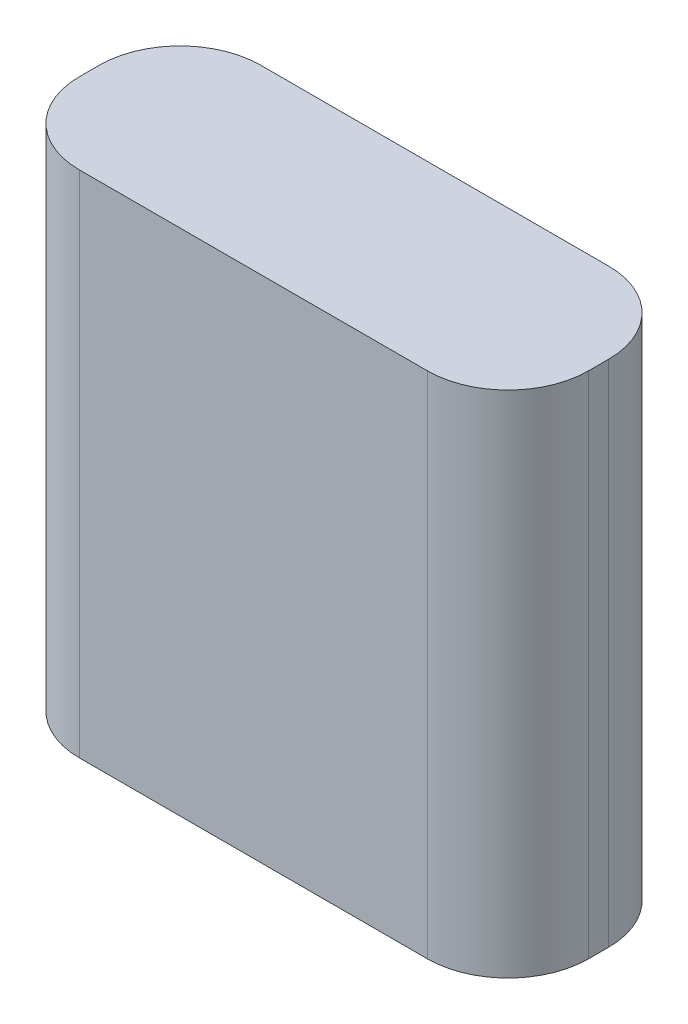
ISO-10303-21;
HEADER;
FILE_DESCRIPTION(('STEP AP214'),'2;1');
FILE_NAME('part.step','',(''),(''),'','','');
FILE_SCHEMA(('AUTOMOTIVE_DESIGN { 1 0 10303 214 1 1 1 1 }'));
ENDSEC;
DATA;
#1=APPLICATION_CONTEXT('core data for automotive mechanical design processes');
#2=APPLICATION_PROTOCOL_DEFINITION('international standard','automotive_design',2000,#1);
#3=PRODUCT_CONTEXT('',#1,'mechanical');
#4=PRODUCT('Part','Part','',(#3));
#5=PRODUCT_RELATED_PRODUCT_CATEGORY('part','',(#4));
#6=PRODUCT_DEFINITION_FORMATION('','',#4);
#7=PRODUCT_DEFINITION_CONTEXT('part definition',#1,'design');
#8=PRODUCT_DEFINITION('design','',#6,#7);
#9=PRODUCT_DEFINITION_SHAPE('','',#8);
#10=(LENGTH_UNIT() NAMED_UNIT(*) SI_UNIT(.MILLI.,.METRE.));
#11=(NAMED_UNIT(*) PLANE_ANGLE_UNIT() SI_UNIT($,.RADIAN.));
#12=(NAMED_UNIT(*) SI_UNIT($,.STERADIAN.) SOLID_ANGLE_UNIT());
#13=UNCERTAINTY_MEASURE_WITH_UNIT(LENGTH_MEASURE(1.E-05),#10,'distance_accuracy_value','');
#14=(GEOMETRIC_REPRESENTATION_CONTEXT(3) GLOBAL_UNCERTAINTY_ASSIGNED_CONTEXT((#13)) GLOBAL_UNIT_ASSIGNED_CONTEXT((#10,
#11,#12)) REPRESENTATION_CONTEXT('',''));
#15=CARTESIAN_POINT('',(0.,0.,0.));
#16=DIRECTION('',(0.,0.,1.));
#17=DIRECTION('',(1.,0.,0.));
#18=AXIS2_PLACEMENT_3D('',#15,#16,#17);
#19=CARTESIAN_POINT('',(40.132,80.264,14.2875));
#20=DIRECTION('',(-1.,0.,0.));
#21=DIRECTION('',(0.,0.,1.));
#22=AXIS2_PLACEMENT_3D('',#19,#20,#21);
#23=PLANE('',#22);
#24=DIRECTION('',(0.,0.,-1.));
#25=VECTOR('',#24,1.);
#26=CARTESIAN_POINT('',(40.132,80.264,14.2875));
#27=LINE('',#26,#25);
#28=CARTESIAN_POINT('',(40.132,80.264,1.5875));
#29=VERTEX_POINT('',#28);
#30=CARTESIAN_POINT('',(40.132,80.264,-1.5875));
#31=VERTEX_POINT('',#30);
#32=EDGE_CURVE('E127',#29,#31,#27,.T.);
#33=ORIENTED_EDGE('',*,*,#32,.F.);
#34=DIRECTION('',(0.,-1.,0.));
#35=VECTOR('',#34,1.);
#36=CARTESIAN_POINT('',(40.132,80.264,1.5875));
#37=LINE('',#36,#35);
#38=CARTESIAN_POINT('',(40.132,0.,1.5875));
#39=VERTEX_POINT('',#38);
#40=EDGE_CURVE('E11',#29,#39,#37,.T.);
#41=ORIENTED_EDGE('',*,*,#40,.T.);
#42=DIRECTION('',(0.,0.,-1.));
#43=VECTOR('',#42,1.);
#44=CARTESIAN_POINT('',(40.132,0.,14.2875));
#45=LINE('',#44,#43);
#46=CARTESIAN_POINT('',(40.132,0.,-1.5875));
#47=VERTEX_POINT('',#46);
#48=EDGE_CURVE('E158',#39,#47,#45,.T.);
#49=ORIENTED_EDGE('',*,*,#48,.T.);
#50=DIRECTION('',(0.,-1.,0.));
#51=VECTOR('',#50,1.);
#52=CARTESIAN_POINT('',(40.132,80.264,-1.5875));
#53=LINE('',#52,#51);
#54=EDGE_CURVE('E41',#47,#31,#53,.F.);
#55=ORIENTED_EDGE('',*,*,#54,.T.);
#56=EDGE_LOOP('',(#33,#41,#49,#55));
#57=FACE_BOUND('',#56,.T.);
#58=ADVANCED_FACE('F33',(#57),#23,.F.);
#59=CARTESIAN_POINT('',(-40.132,80.264,-14.2875));
#60=DIRECTION('',(0.,0.,1.));
#61=DIRECTION('',(1.,0.,0.));
#62=AXIS2_PLACEMENT_3D('',#59,#60,#61);
#63=PLANE('',#62);
#64=DIRECTION('',(-1.,0.,0.));
#65=VECTOR('',#64,1.);
#66=CARTESIAN_POINT('',(-40.132,0.,-14.2875));
#67=LINE('',#66,#65);
#68=CARTESIAN_POINT('',(27.432,0.,-14.2875));
#69=VERTEX_POINT('',#68);
#70=CARTESIAN_POINT('',(-27.432,0.,-14.2875));
#71=VERTEX_POINT('',#70);
#72=EDGE_CURVE('E132',#69,#71,#67,.T.);
#73=ORIENTED_EDGE('',*,*,#72,.T.);
#74=DIRECTION('',(0.,-1.,0.));
#75=VECTOR('',#74,1.);
#76=CARTESIAN_POINT('',(-27.432,80.264,-14.2875));
#77=LINE('',#76,#75);
#78=CARTESIAN_POINT('',(-27.432,80.264,-14.2875));
#79=VERTEX_POINT('',#78);
#80=EDGE_CURVE('E48',#71,#79,#77,.F.);
#81=ORIENTED_EDGE('',*,*,#80,.T.);
#82=DIRECTION('',(-1.,0.,0.));
#83=VECTOR('',#82,1.);
#84=CARTESIAN_POINT('',(-40.132,80.264,-14.2875));
#85=LINE('',#84,#83);
#86=CARTESIAN_POINT('',(27.432,80.264,-14.2875));
#87=VERTEX_POINT('',#86);
#88=EDGE_CURVE('E130',#87,#79,#85,.T.);
#89=ORIENTED_EDGE('',*,*,#88,.F.);
#90=DIRECTION('',(0.,-1.,0.));
#91=VECTOR('',#90,1.);
#92=CARTESIAN_POINT('',(27.432,80.264,-14.2875));
#93=LINE('',#92,#91);
#94=EDGE_CURVE('E150',#87,#69,#93,.T.);
#95=ORIENTED_EDGE('',*,*,#94,.T.);
#96=EDGE_LOOP('',(#73,#81,#89,#95));
#97=FACE_BOUND('',#96,.T.);
#98=ADVANCED_FACE('F165',(#97),#63,.F.);
#99=CARTESIAN_POINT('',(-40.132,80.264,14.2875));
#100=DIRECTION('',(1.,0.,0.));
#101=DIRECTION('',(0.,0.,-1.));
#102=AXIS2_PLACEMENT_3D('',#99,#100,#101);
#103=PLANE('',#102);
#104=DIRECTION('',(0.,0.,1.));
#105=VECTOR('',#104,1.);
#106=CARTESIAN_POINT('',(-40.132,0.,14.2875));
#107=LINE('',#106,#105);
#108=CARTESIAN_POINT('',(-40.132,0.,-1.5875));
#109=VERTEX_POINT('',#108);
#110=CARTESIAN_POINT('',(-40.132,0.,1.5875));
#111=VERTEX_POINT('',#110);
#112=EDGE_CURVE('E128',#109,#111,#107,.T.);
#113=ORIENTED_EDGE('',*,*,#112,.T.);
#114=DIRECTION('',(0.,-1.,0.));
#115=VECTOR('',#114,1.);
#116=CARTESIAN_POINT('',(-40.132,80.264,1.5875));
#117=LINE('',#116,#115);
#118=CARTESIAN_POINT('',(-40.132,80.264,1.5875));
#119=VERTEX_POINT('',#118);
#120=EDGE_CURVE('E105',#111,#119,#117,.F.);
#121=ORIENTED_EDGE('',*,*,#120,.T.);
#122=DIRECTION('',(0.,0.,1.));
#123=VECTOR('',#122,1.);
#124=CARTESIAN_POINT('',(-40.132,80.264,14.2875));
#125=LINE('',#124,#123);
#126=CARTESIAN_POINT('',(-40.132,80.264,-1.5875));
#127=VERTEX_POINT('',#126);
#128=EDGE_CURVE('E169',#127,#119,#125,.T.);
#129=ORIENTED_EDGE('',*,*,#128,.F.);
#130=DIRECTION('',(0.,-1.,0.));
#131=VECTOR('',#130,1.);
#132=CARTESIAN_POINT('',(-40.132,80.264,-1.5875));
#133=LINE('',#132,#131);
#134=EDGE_CURVE('E110',#127,#109,#133,.T.);
#135=ORIENTED_EDGE('',*,*,#134,.T.);
#136=EDGE_LOOP('',(#113,#121,#129,#135));
#137=FACE_BOUND('',#136,.T.);
#138=ADVANCED_FACE('F177',(#137),#103,.F.);
#139=CARTESIAN_POINT('',(-40.132,80.264,14.2875));
#140=DIRECTION('',(0.,0.,-1.));
#141=DIRECTION('',(-1.,0.,0.));
#142=AXIS2_PLACEMENT_3D('',#139,#140,#141);
#143=PLANE('',#142);
#144=DIRECTION('',(1.,0.,0.));
#145=VECTOR('',#144,1.);
#146=CARTESIAN_POINT('',(-40.132,80.264,14.2875));
#147=LINE('',#146,#145);
#148=CARTESIAN_POINT('',(-27.432,80.264,14.2875));
#149=VERTEX_POINT('',#148);
#150=CARTESIAN_POINT('',(27.432,80.264,14.2875));
#151=VERTEX_POINT('',#150);
#152=EDGE_CURVE('E120',#149,#151,#147,.T.);
#153=ORIENTED_EDGE('',*,*,#152,.F.);
#154=DIRECTION('',(0.,-1.,0.));
#155=VECTOR('',#154,1.);
#156=CARTESIAN_POINT('',(-27.432,80.264,14.2875));
#157=LINE('',#156,#155);
#158=CARTESIAN_POINT('',(-27.432,0.,14.2875));
#159=VERTEX_POINT('',#158);
#160=EDGE_CURVE('E104',#149,#159,#157,.T.);
#161=ORIENTED_EDGE('',*,*,#160,.T.);
#162=DIRECTION('',(1.,0.,0.));
#163=VECTOR('',#162,1.);
#164=CARTESIAN_POINT('',(-40.132,0.,14.2875));
#165=LINE('',#164,#163);
#166=CARTESIAN_POINT('',(27.432,0.,14.2875));
#167=VERTEX_POINT('',#166);
#168=EDGE_CURVE('E117',#159,#167,#165,.T.);
#169=ORIENTED_EDGE('',*,*,#168,.T.);
#170=DIRECTION('',(0.,-1.,0.));
#171=VECTOR('',#170,1.);
#172=CARTESIAN_POINT('',(27.432,80.264,14.2875));
#173=LINE('',#172,#171);
#174=EDGE_CURVE('E122',#167,#151,#173,.F.);
#175=ORIENTED_EDGE('',*,*,#174,.T.);
#176=EDGE_LOOP('',(#153,#161,#169,#175));
#177=FACE_BOUND('',#176,.T.);
#178=ADVANCED_FACE('F116',(#177),#143,.F.);
#179=CARTESIAN_POINT('',(0.,80.264,0.));
#180=DIRECTION('',(0.,-1.,0.));
#181=DIRECTION('',(0.,0.,-1.));
#182=AXIS2_PLACEMENT_3D('',#179,#180,#181);
#183=PLANE('',#182);
#184=ORIENTED_EDGE('',*,*,#128,.T.);
#185=CARTESIAN_POINT('',(-27.432,80.264,1.5875));
#186=DIRECTION('',(0.,-1.,0.));
#187=DIRECTION('',(0.,0.,-1.));
#188=AXIS2_PLACEMENT_3D('',#185,#186,#187);
#189=CIRCLE('',#188,12.7);
#190=EDGE_CURVE('E148',#119,#149,#189,.F.);
#191=ORIENTED_EDGE('',*,*,#190,.T.);
#192=ORIENTED_EDGE('',*,*,#152,.T.);
#193=CARTESIAN_POINT('',(27.432,80.264,1.5875));
#194=DIRECTION('',(0.,-1.,0.));
#195=DIRECTION('',(0.,0.,-1.));
#196=AXIS2_PLACEMENT_3D('',#193,#194,#195);
#197=CIRCLE('',#196,12.7);
#198=EDGE_CURVE('E144',#151,#29,#197,.F.);
#199=ORIENTED_EDGE('',*,*,#198,.T.);
#200=ORIENTED_EDGE('',*,*,#32,.T.);
#201=CARTESIAN_POINT('',(27.432,80.264,-1.5875));
#202=DIRECTION('',(0.,-1.,0.));
#203=DIRECTION('',(0.,0.,-1.));
#204=AXIS2_PLACEMENT_3D('',#201,#202,#203);
#205=CIRCLE('',#204,12.7);
#206=EDGE_CURVE('E55',#31,#87,#205,.F.);
#207=ORIENTED_EDGE('',*,*,#206,.T.);
#208=ORIENTED_EDGE('',*,*,#88,.T.);
#209=CARTESIAN_POINT('',(-27.432,80.264,-1.5875));
#210=DIRECTION('',(0.,-1.,0.));
#211=DIRECTION('',(0.,0.,-1.));
#212=AXIS2_PLACEMENT_3D('',#209,#210,#211);
#213=CIRCLE('',#212,12.7);
#214=EDGE_CURVE('E146',#79,#127,#213,.F.);
#215=ORIENTED_EDGE('',*,*,#214,.T.);
#216=EDGE_LOOP('',(#184,#191,#192,#199,#200,#207,#208,#215));
#217=FACE_BOUND('',#216,.T.);
#218=ADVANCED_FACE('F161',(#217),#183,.F.);
#219=CARTESIAN_POINT('',(0.,0.,0.));
#220=DIRECTION('',(0.,-1.,0.));
#221=DIRECTION('',(0.,0.,-1.));
#222=AXIS2_PLACEMENT_3D('',#219,#220,#221);
#223=PLANE('',#222);
#224=ORIENTED_EDGE('',*,*,#168,.F.);
#225=CARTESIAN_POINT('',(-27.432,0.,1.5875));
#226=DIRECTION('',(0.,-1.,0.));
#227=DIRECTION('',(0.,0.,-1.));
#228=AXIS2_PLACEMENT_3D('',#225,#226,#227);
#229=CIRCLE('',#228,12.7);
#230=EDGE_CURVE('E100',#159,#111,#229,.T.);
#231=ORIENTED_EDGE('',*,*,#230,.T.);
#232=ORIENTED_EDGE('',*,*,#112,.F.);
#233=CARTESIAN_POINT('',(-27.432,0.,-1.5875));
#234=DIRECTION('',(0.,-1.,0.));
#235=DIRECTION('',(0.,0.,-1.));
#236=AXIS2_PLACEMENT_3D('',#233,#234,#235);
#237=CIRCLE('',#236,12.7);
#238=EDGE_CURVE('E111',#109,#71,#237,.T.);
#239=ORIENTED_EDGE('',*,*,#238,.T.);
#240=ORIENTED_EDGE('',*,*,#72,.F.);
#241=CARTESIAN_POINT('',(27.432,0.,-1.5875));
#242=DIRECTION('',(0.,-1.,0.));
#243=DIRECTION('',(0.,0.,-1.));
#244=AXIS2_PLACEMENT_3D('',#241,#242,#243);
#245=CIRCLE('',#244,12.7);
#246=EDGE_CURVE('E121',#69,#47,#245,.T.);
#247=ORIENTED_EDGE('',*,*,#246,.T.);
#248=ORIENTED_EDGE('',*,*,#48,.F.);
#249=CARTESIAN_POINT('',(27.432,0.,1.5875));
#250=DIRECTION('',(0.,-1.,0.));
#251=DIRECTION('',(0.,0.,-1.));
#252=AXIS2_PLACEMENT_3D('',#249,#250,#251);
#253=CIRCLE('',#252,12.7);
#254=EDGE_CURVE('E126',#39,#167,#253,.T.);
#255=ORIENTED_EDGE('',*,*,#254,.T.);
#256=EDGE_LOOP('',(#224,#231,#232,#239,#240,#247,#248,#255));
#257=FACE_BOUND('',#256,.T.);
#258=ADVANCED_FACE('F124',(#257),#223,.T.);
#259=CARTESIAN_POINT('',(-27.432,80.264,1.5875));
#260=DIRECTION('',(0.,-1.,0.));
#261=DIRECTION('',(0.,0.,-1.));
#262=AXIS2_PLACEMENT_3D('',#259,#260,#261);
#263=CYLINDRICAL_SURFACE('',#262,12.7);
#264=ORIENTED_EDGE('',*,*,#190,.F.);
#265=ORIENTED_EDGE('',*,*,#120,.F.);
#266=ORIENTED_EDGE('',*,*,#230,.F.);
#267=ORIENTED_EDGE('',*,*,#160,.F.);
#268=EDGE_LOOP('',(#264,#265,#266,#267));
#269=FACE_BOUND('',#268,.T.);
#270=ADVANCED_FACE('F103',(#269),#263,.T.);
#271=CARTESIAN_POINT('',(-27.432,80.264,-1.5875));
#272=DIRECTION('',(0.,-1.,0.));
#273=DIRECTION('',(0.,0.,-1.));
#274=AXIS2_PLACEMENT_3D('',#271,#272,#273);
#275=CYLINDRICAL_SURFACE('',#274,12.7);
#276=ORIENTED_EDGE('',*,*,#214,.F.);
#277=ORIENTED_EDGE('',*,*,#80,.F.);
#278=ORIENTED_EDGE('',*,*,#238,.F.);
#279=ORIENTED_EDGE('',*,*,#134,.F.);
#280=EDGE_LOOP('',(#276,#277,#278,#279));
#281=FACE_BOUND('',#280,.T.);
#282=ADVANCED_FACE('F175',(#281),#275,.T.);
#283=CARTESIAN_POINT('',(27.432,80.264,1.5875));
#284=DIRECTION('',(0.,-1.,0.));
#285=DIRECTION('',(0.,0.,-1.));
#286=AXIS2_PLACEMENT_3D('',#283,#284,#285);
#287=CYLINDRICAL_SURFACE('',#286,12.7);
#288=ORIENTED_EDGE('',*,*,#198,.F.);
#289=ORIENTED_EDGE('',*,*,#174,.F.);
#290=ORIENTED_EDGE('',*,*,#254,.F.);
#291=ORIENTED_EDGE('',*,*,#40,.F.);
#292=EDGE_LOOP('',(#288,#289,#290,#291));
#293=FACE_BOUND('',#292,.T.);
#294=ADVANCED_FACE('F179',(#293),#287,.T.);
#295=CARTESIAN_POINT('',(27.432,80.264,-1.5875));
#296=DIRECTION('',(0.,-1.,0.));
#297=DIRECTION('',(0.,0.,-1.));
#298=AXIS2_PLACEMENT_3D('',#295,#296,#297);
#299=CYLINDRICAL_SURFACE('',#298,12.7);
#300=ORIENTED_EDGE('',*,*,#206,.F.);
#301=ORIENTED_EDGE('',*,*,#54,.F.);
#302=ORIENTED_EDGE('',*,*,#246,.F.);
#303=ORIENTED_EDGE('',*,*,#94,.F.);
#304=EDGE_LOOP('',(#300,#301,#302,#303));
#305=FACE_BOUND('',#304,.T.);
#306=ADVANCED_FACE('F35',(#305),#299,.T.);
#307=CLOSED_SHELL('',(#58,#98,#138,#178,#218,#258,#270,#282,#294,#306));
#308=MANIFOLD_SOLID_BREP('B2',#307);
#309=ADVANCED_BREP_SHAPE_REPRESENTATION('',(#18,#308),#14);
#310=SHAPE_DEFINITION_REPRESENTATION(#9,#309);
ENDSEC;
END-ISO-10303-21;
